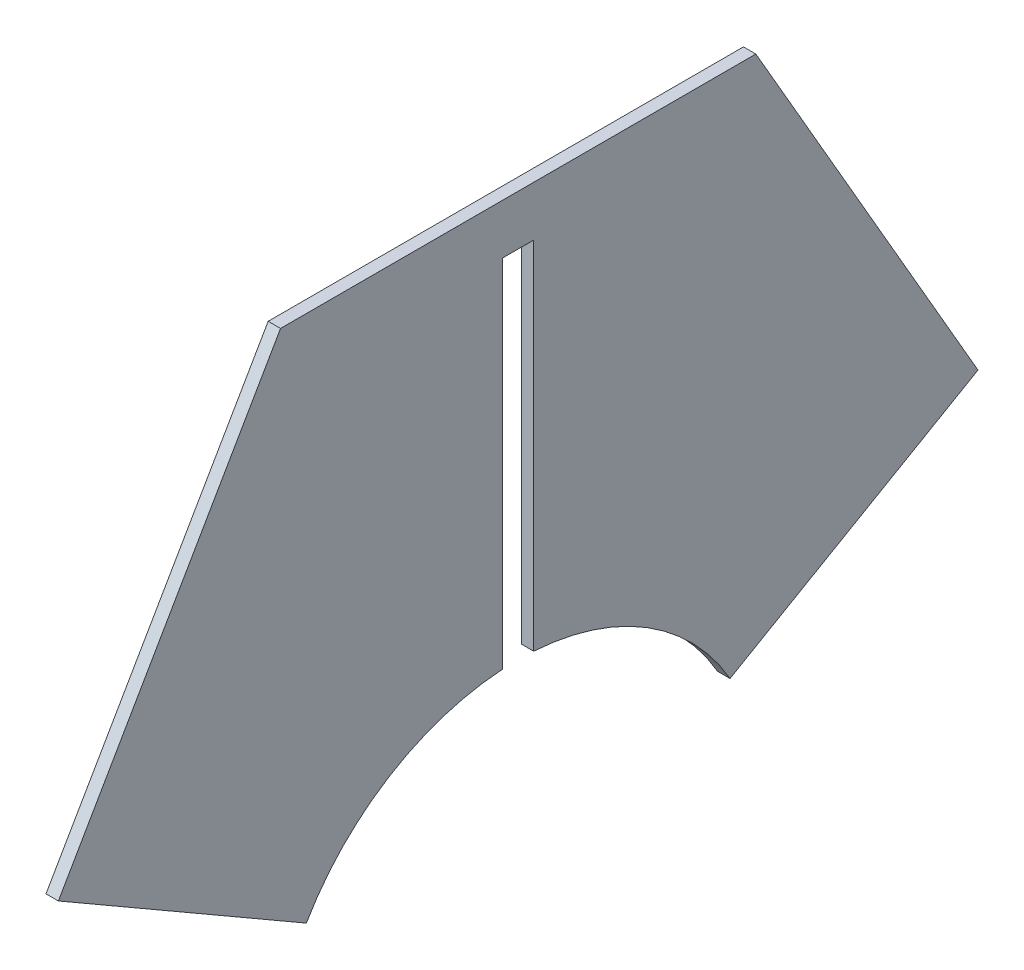
ISO-10303-21;
HEADER;
FILE_DESCRIPTION(('STEP AP214'),'2;1');
FILE_NAME('part.step','',(''),(''),'','','');
FILE_SCHEMA(('AUTOMOTIVE_DESIGN { 1 0 10303 214 1 1 1 1 }'));
ENDSEC;
DATA;
#1=APPLICATION_CONTEXT('core data for automotive mechanical design processes');
#2=APPLICATION_PROTOCOL_DEFINITION('international standard','automotive_design',2000,#1);
#3=PRODUCT_CONTEXT('',#1,'mechanical');
#4=PRODUCT('Part','Part','',(#3));
#5=PRODUCT_RELATED_PRODUCT_CATEGORY('part','',(#4));
#6=PRODUCT_DEFINITION_FORMATION('','',#4);
#7=PRODUCT_DEFINITION_CONTEXT('part definition',#1,'design');
#8=PRODUCT_DEFINITION('design','',#6,#7);
#9=PRODUCT_DEFINITION_SHAPE('','',#8);
#10=(LENGTH_UNIT() NAMED_UNIT(*) SI_UNIT(.MILLI.,.METRE.));
#11=(NAMED_UNIT(*) PLANE_ANGLE_UNIT() SI_UNIT($,.RADIAN.));
#12=(NAMED_UNIT(*) SI_UNIT($,.STERADIAN.) SOLID_ANGLE_UNIT());
#13=UNCERTAINTY_MEASURE_WITH_UNIT(LENGTH_MEASURE(1.E-05),#10,'distance_accuracy_value','');
#14=(GEOMETRIC_REPRESENTATION_CONTEXT(3) GLOBAL_UNCERTAINTY_ASSIGNED_CONTEXT((#13)) GLOBAL_UNIT_ASSIGNED_CONTEXT((#10,
#11,#12)) REPRESENTATION_CONTEXT('',''));
#15=CARTESIAN_POINT('',(0.,0.,0.));
#16=DIRECTION('',(0.,0.,1.));
#17=DIRECTION('',(1.,0.,0.));
#18=AXIS2_PLACEMENT_3D('',#15,#16,#17);
#19=CARTESIAN_POINT('',(4.,0.,0.));
#20=DIRECTION('',(-1.,0.,0.));
#21=DIRECTION('',(0.,0.,1.));
#22=AXIS2_PLACEMENT_3D('',#19,#20,#21);
#23=CYLINDRICAL_SURFACE('',#22,79.);
#24=CARTESIAN_POINT('',(0.,0.,0.));
#25=DIRECTION('',(-1.,0.,0.));
#26=DIRECTION('',(0.,0.,1.));
#27=AXIS2_PLACEMENT_3D('',#24,#25,#26);
#28=CIRCLE('',#27,79.);
#29=CARTESIAN_POINT('',(0.,39.5000000000003,68.4160068989705));
#30=VERTEX_POINT('',#29);
#31=CARTESIAN_POINT('',(0.,78.8416133777081,5.));
#32=VERTEX_POINT('',#31);
#33=EDGE_CURVE('E141',#30,#32,#28,.T.);
#34=ORIENTED_EDGE('',*,*,#33,.T.);
#35=DIRECTION('',(-1.,0.,0.));
#36=VECTOR('',#35,1.);
#37=CARTESIAN_POINT('',(4.,78.8416133777081,5.));
#38=LINE('',#37,#36);
#39=CARTESIAN_POINT('',(4.,78.8416133777081,5.));
#40=VERTEX_POINT('',#39);
#41=EDGE_CURVE('E11',#40,#32,#38,.T.);
#42=ORIENTED_EDGE('',*,*,#41,.F.);
#43=CARTESIAN_POINT('',(4.,0.,0.));
#44=DIRECTION('',(-1.,0.,0.));
#45=DIRECTION('',(0.,0.,1.));
#46=AXIS2_PLACEMENT_3D('',#43,#44,#45);
#47=CIRCLE('',#46,79.);
#48=CARTESIAN_POINT('',(4.,39.5000000000003,68.4160068989705));
#49=VERTEX_POINT('',#48);
#50=EDGE_CURVE('E159',#49,#40,#47,.T.);
#51=ORIENTED_EDGE('',*,*,#50,.F.);
#52=DIRECTION('',(-1.,0.,0.));
#53=VECTOR('',#52,1.);
#54=CARTESIAN_POINT('',(4.,39.5000000000003,68.4160068989705));
#55=LINE('',#54,#53);
#56=EDGE_CURVE('E137',#49,#30,#55,.T.);
#57=ORIENTED_EDGE('',*,*,#56,.T.);
#58=EDGE_LOOP('',(#34,#42,#51,#57));
#59=FACE_BOUND('',#58,.T.);
#60=ADVANCED_FACE('F33',(#59),#23,.F.);
#61=CARTESIAN_POINT('',(4.,78.8416133777081,5.));
#62=DIRECTION('',(0.,0.,1.));
#63=DIRECTION('',(1.,0.,0.));
#64=AXIS2_PLACEMENT_3D('',#61,#62,#63);
#65=PLANE('',#64);
#66=DIRECTION('',(0.,1.,0.));
#67=VECTOR('',#66,1.);
#68=CARTESIAN_POINT('',(0.,78.8416133777081,5.));
#69=LINE('',#68,#67);
#70=CARTESIAN_POINT('',(0.,193.841613377708,5.));
#71=VERTEX_POINT('',#70);
#72=EDGE_CURVE('E144',#32,#71,#69,.T.);
#73=ORIENTED_EDGE('',*,*,#72,.T.);
#74=DIRECTION('',(-1.,0.,0.));
#75=VECTOR('',#74,1.);
#76=CARTESIAN_POINT('',(4.,193.841613377708,5.));
#77=LINE('',#76,#75);
#78=CARTESIAN_POINT('',(4.,193.841613377708,5.));
#79=VERTEX_POINT('',#78);
#80=EDGE_CURVE('E41',#79,#71,#77,.T.);
#81=ORIENTED_EDGE('',*,*,#80,.F.);
#82=DIRECTION('',(0.,1.,0.));
#83=VECTOR('',#82,1.);
#84=CARTESIAN_POINT('',(4.,78.8416133777081,5.));
#85=LINE('',#84,#83);
#86=EDGE_CURVE('E98',#40,#79,#85,.T.);
#87=ORIENTED_EDGE('',*,*,#86,.F.);
#88=ORIENTED_EDGE('',*,*,#41,.T.);
#89=EDGE_LOOP('',(#73,#81,#87,#88));
#90=FACE_BOUND('',#89,.T.);
#91=ADVANCED_FACE('F208',(#90),#65,.F.);
#92=CARTESIAN_POINT('',(4.,193.841613377708,5.));
#93=DIRECTION('',(0.,1.,0.));
#94=DIRECTION('',(0.,0.,1.));
#95=AXIS2_PLACEMENT_3D('',#92,#93,#94);
#96=PLANE('',#95);
#97=DIRECTION('',(0.,0.,-1.));
#98=VECTOR('',#97,1.);
#99=CARTESIAN_POINT('',(0.,193.841613377708,5.));
#100=LINE('',#99,#98);
#101=CARTESIAN_POINT('',(0.,193.841613377708,-5.));
#102=VERTEX_POINT('',#101);
#103=EDGE_CURVE('E146',#71,#102,#100,.T.);
#104=ORIENTED_EDGE('',*,*,#103,.T.);
#105=DIRECTION('',(-1.,0.,0.));
#106=VECTOR('',#105,1.);
#107=CARTESIAN_POINT('',(4.,193.841613377708,-5.));
#108=LINE('',#107,#106);
#109=CARTESIAN_POINT('',(4.,193.841613377708,-5.));
#110=VERTEX_POINT('',#109);
#111=EDGE_CURVE('E172',#110,#102,#108,.T.);
#112=ORIENTED_EDGE('',*,*,#111,.F.);
#113=DIRECTION('',(0.,0.,-1.));
#114=VECTOR('',#113,1.);
#115=CARTESIAN_POINT('',(4.,193.841613377708,5.));
#116=LINE('',#115,#114);
#117=EDGE_CURVE('E180',#79,#110,#116,.T.);
#118=ORIENTED_EDGE('',*,*,#117,.F.);
#119=ORIENTED_EDGE('',*,*,#80,.T.);
#120=EDGE_LOOP('',(#104,#112,#118,#119));
#121=FACE_BOUND('',#120,.T.);
#122=ADVANCED_FACE('F178',(#121),#96,.F.);
#123=CARTESIAN_POINT('',(4.,193.841613377708,-5.));
#124=DIRECTION('',(0.,0.,-1.));
#125=DIRECTION('',(-1.,0.,0.));
#126=AXIS2_PLACEMENT_3D('',#123,#124,#125);
#127=PLANE('',#126);
#128=DIRECTION('',(0.,-1.,0.));
#129=VECTOR('',#128,1.);
#130=CARTESIAN_POINT('',(0.,193.841613377708,-5.));
#131=LINE('',#130,#129);
#132=CARTESIAN_POINT('',(0.,78.8416133777081,-5.));
#133=VERTEX_POINT('',#132);
#134=EDGE_CURVE('E148',#102,#133,#131,.T.);
#135=ORIENTED_EDGE('',*,*,#134,.T.);
#136=DIRECTION('',(-1.,0.,0.));
#137=VECTOR('',#136,1.);
#138=CARTESIAN_POINT('',(4.,78.8416133777081,-5.));
#139=LINE('',#138,#137);
#140=CARTESIAN_POINT('',(4.,78.8416133777081,-5.));
#141=VERTEX_POINT('',#140);
#142=EDGE_CURVE('E169',#141,#133,#139,.T.);
#143=ORIENTED_EDGE('',*,*,#142,.F.);
#144=DIRECTION('',(0.,-1.,0.));
#145=VECTOR('',#144,1.);
#146=CARTESIAN_POINT('',(4.,193.841613377708,-5.));
#147=LINE('',#146,#145);
#148=EDGE_CURVE('E198',#110,#141,#147,.T.);
#149=ORIENTED_EDGE('',*,*,#148,.F.);
#150=ORIENTED_EDGE('',*,*,#111,.T.);
#151=EDGE_LOOP('',(#135,#143,#149,#150));
#152=FACE_BOUND('',#151,.T.);
#153=ADVANCED_FACE('F189',(#152),#127,.F.);
#154=CARTESIAN_POINT('',(4.,0.,0.));
#155=DIRECTION('',(-1.,0.,0.));
#156=DIRECTION('',(0.,0.,1.));
#157=AXIS2_PLACEMENT_3D('',#154,#155,#156);
#158=CYLINDRICAL_SURFACE('',#157,79.);
#159=CARTESIAN_POINT('',(0.,0.,0.));
#160=DIRECTION('',(-1.,0.,0.));
#161=DIRECTION('',(0.,0.,-1.));
#162=AXIS2_PLACEMENT_3D('',#159,#160,#161);
#163=CIRCLE('',#162,79.);
#164=CARTESIAN_POINT('',(0.,39.4999999999998,-68.4160068989707));
#165=VERTEX_POINT('',#164);
#166=EDGE_CURVE('E150',#133,#165,#163,.T.);
#167=ORIENTED_EDGE('',*,*,#166,.T.);
#168=DIRECTION('',(-1.,0.,0.));
#169=VECTOR('',#168,1.);
#170=CARTESIAN_POINT('',(4.,39.4999999999998,-68.4160068989707));
#171=LINE('',#170,#169);
#172=CARTESIAN_POINT('',(4.,39.4999999999998,-68.4160068989707));
#173=VERTEX_POINT('',#172);
#174=EDGE_CURVE('E166',#173,#165,#171,.T.);
#175=ORIENTED_EDGE('',*,*,#174,.F.);
#176=CARTESIAN_POINT('',(4.,0.,0.));
#177=DIRECTION('',(-1.,0.,0.));
#178=DIRECTION('',(0.,0.,-1.));
#179=AXIS2_PLACEMENT_3D('',#176,#177,#178);
#180=CIRCLE('',#179,79.);
#181=EDGE_CURVE('E195',#141,#173,#180,.T.);
#182=ORIENTED_EDGE('',*,*,#181,.F.);
#183=ORIENTED_EDGE('',*,*,#142,.T.);
#184=EDGE_LOOP('',(#167,#175,#182,#183));
#185=FACE_BOUND('',#184,.T.);
#186=ADVANCED_FACE('F193',(#185),#158,.F.);
#187=CARTESIAN_POINT('',(4.,85.7365149746589,-148.5));
#188=DIRECTION('',(0.,0.86602540378444,0.499999999999998));
#189=DIRECTION('',(0.,-0.499999999999998,0.86602540378444));
#190=AXIS2_PLACEMENT_3D('',#187,#188,#189);
#191=PLANE('',#190);
#192=DIRECTION('',(0.,0.499999999999998,-0.86602540378444));
#193=VECTOR('',#192,1.);
#194=CARTESIAN_POINT('',(0.,85.7365149746589,-148.5));
#195=LINE('',#194,#193);
#196=CARTESIAN_POINT('',(0.,85.7365149746589,-148.5));
#197=VERTEX_POINT('',#196);
#198=EDGE_CURVE('E152',#165,#197,#195,.T.);
#199=ORIENTED_EDGE('',*,*,#198,.T.);
#200=DIRECTION('',(-1.,0.,0.));
#201=VECTOR('',#200,1.);
#202=CARTESIAN_POINT('',(4.,85.7365149746589,-148.5));
#203=LINE('',#202,#201);
#204=CARTESIAN_POINT('',(4.,85.7365149746589,-148.5));
#205=VERTEX_POINT('',#204);
#206=EDGE_CURVE('E163',#205,#197,#203,.T.);
#207=ORIENTED_EDGE('',*,*,#206,.F.);
#208=DIRECTION('',(0.,0.499999999999998,-0.86602540378444));
#209=VECTOR('',#208,1.);
#210=CARTESIAN_POINT('',(4.,85.7365149746589,-148.5));
#211=LINE('',#210,#209);
#212=EDGE_CURVE('E197',#173,#205,#211,.T.);
#213=ORIENTED_EDGE('',*,*,#212,.F.);
#214=ORIENTED_EDGE('',*,*,#174,.T.);
#215=EDGE_LOOP('',(#199,#207,#213,#214));
#216=FACE_BOUND('',#215,.T.);
#217=ADVANCED_FACE('F220',(#216),#191,.F.);
#218=CARTESIAN_POINT('',(4.,210.,-76.7564434701784));
#219=DIRECTION('',(0.,-0.499999999999998,0.86602540378444));
#220=DIRECTION('',(0.,-0.86602540378444,-0.499999999999998));
#221=AXIS2_PLACEMENT_3D('',#218,#219,#220);
#222=PLANE('',#221);
#223=DIRECTION('',(0.,0.86602540378444,0.499999999999998));
#224=VECTOR('',#223,1.);
#225=CARTESIAN_POINT('',(0.,210.,-76.7564434701784));
#226=LINE('',#225,#224);
#227=CARTESIAN_POINT('',(0.,210.,-76.7564434701784));
#228=VERTEX_POINT('',#227);
#229=EDGE_CURVE('E154',#197,#228,#226,.T.);
#230=ORIENTED_EDGE('',*,*,#229,.T.);
#231=DIRECTION('',(-1.,0.,0.));
#232=VECTOR('',#231,1.);
#233=CARTESIAN_POINT('',(4.,210.,-76.7564434701784));
#234=LINE('',#233,#232);
#235=CARTESIAN_POINT('',(4.,210.,-76.7564434701784));
#236=VERTEX_POINT('',#235);
#237=EDGE_CURVE('E132',#236,#228,#234,.T.);
#238=ORIENTED_EDGE('',*,*,#237,.F.);
#239=DIRECTION('',(0.,0.86602540378444,0.499999999999998));
#240=VECTOR('',#239,1.);
#241=CARTESIAN_POINT('',(4.,210.,-76.7564434701784));
#242=LINE('',#241,#240);
#243=EDGE_CURVE('E123',#205,#236,#242,.T.);
#244=ORIENTED_EDGE('',*,*,#243,.F.);
#245=ORIENTED_EDGE('',*,*,#206,.T.);
#246=EDGE_LOOP('',(#230,#238,#244,#245));
#247=FACE_BOUND('',#246,.T.);
#248=ADVANCED_FACE('F223',(#247),#222,.F.);
#249=CARTESIAN_POINT('',(4.,210.,76.7564434701784));
#250=DIRECTION('',(0.,-1.,0.));
#251=DIRECTION('',(0.,0.,-1.));
#252=AXIS2_PLACEMENT_3D('',#249,#250,#251);
#253=PLANE('',#252);
#254=DIRECTION('',(0.,0.,1.));
#255=VECTOR('',#254,1.);
#256=CARTESIAN_POINT('',(0.,210.,76.7564434701784));
#257=LINE('',#256,#255);
#258=CARTESIAN_POINT('',(0.,210.,76.7564434701784));
#259=VERTEX_POINT('',#258);
#260=EDGE_CURVE('E131',#228,#259,#257,.T.);
#261=ORIENTED_EDGE('',*,*,#260,.T.);
#262=DIRECTION('',(-1.,0.,0.));
#263=VECTOR('',#262,1.);
#264=CARTESIAN_POINT('',(4.,210.,76.7564434701784));
#265=LINE('',#264,#263);
#266=CARTESIAN_POINT('',(4.,210.,76.7564434701784));
#267=VERTEX_POINT('',#266);
#268=EDGE_CURVE('E128',#267,#259,#265,.T.);
#269=ORIENTED_EDGE('',*,*,#268,.F.);
#270=DIRECTION('',(0.,0.,1.));
#271=VECTOR('',#270,1.);
#272=CARTESIAN_POINT('',(4.,210.,76.7564434701784));
#273=LINE('',#272,#271);
#274=EDGE_CURVE('E117',#236,#267,#273,.T.);
#275=ORIENTED_EDGE('',*,*,#274,.F.);
#276=ORIENTED_EDGE('',*,*,#237,.T.);
#277=EDGE_LOOP('',(#261,#269,#275,#276));
#278=FACE_BOUND('',#277,.T.);
#279=ADVANCED_FACE('F129',(#278),#253,.F.);
#280=CARTESIAN_POINT('',(4.,85.7365149746603,148.5));
#281=DIRECTION('',(0.,-0.500000000000004,-0.866025403784436));
#282=DIRECTION('',(0.,0.866025403784436,-0.500000000000004));
#283=AXIS2_PLACEMENT_3D('',#280,#281,#282);
#284=PLANE('',#283);
#285=DIRECTION('',(0.,-0.866025403784436,0.500000000000004));
#286=VECTOR('',#285,1.);
#287=CARTESIAN_POINT('',(0.,85.7365149746603,148.5));
#288=LINE('',#287,#286);
#289=CARTESIAN_POINT('',(0.,85.7365149746603,148.5));
#290=VERTEX_POINT('',#289);
#291=EDGE_CURVE('E84',#259,#290,#288,.T.);
#292=ORIENTED_EDGE('',*,*,#291,.T.);
#293=DIRECTION('',(-1.,0.,0.));
#294=VECTOR('',#293,1.);
#295=CARTESIAN_POINT('',(4.,85.7365149746603,148.5));
#296=LINE('',#295,#294);
#297=CARTESIAN_POINT('',(4.,85.7365149746603,148.5));
#298=VERTEX_POINT('',#297);
#299=EDGE_CURVE('E133',#298,#290,#296,.T.);
#300=ORIENTED_EDGE('',*,*,#299,.F.);
#301=DIRECTION('',(0.,-0.866025403784436,0.500000000000004));
#302=VECTOR('',#301,1.);
#303=CARTESIAN_POINT('',(4.,85.7365149746603,148.5));
#304=LINE('',#303,#302);
#305=EDGE_CURVE('E121',#267,#298,#304,.T.);
#306=ORIENTED_EDGE('',*,*,#305,.F.);
#307=ORIENTED_EDGE('',*,*,#268,.T.);
#308=EDGE_LOOP('',(#292,#300,#306,#307));
#309=FACE_BOUND('',#308,.T.);
#310=ADVANCED_FACE('F135',(#309),#284,.F.);
#311=CARTESIAN_POINT('',(4.,39.5000000000003,68.4160068989705));
#312=DIRECTION('',(0.,0.866025403784436,-0.500000000000004));
#313=DIRECTION('',(0.,0.500000000000004,0.866025403784436));
#314=AXIS2_PLACEMENT_3D('',#311,#312,#313);
#315=PLANE('',#314);
#316=DIRECTION('',(0.,-0.500000000000004,-0.866025403784436));
#317=VECTOR('',#316,1.);
#318=CARTESIAN_POINT('',(0.,39.5000000000003,68.4160068989705));
#319=LINE('',#318,#317);
#320=EDGE_CURVE('E90',#290,#30,#319,.T.);
#321=ORIENTED_EDGE('',*,*,#320,.T.);
#322=ORIENTED_EDGE('',*,*,#56,.F.);
#323=DIRECTION('',(0.,-0.500000000000004,-0.866025403784436));
#324=VECTOR('',#323,1.);
#325=CARTESIAN_POINT('',(4.,39.5000000000003,68.4160068989705));
#326=LINE('',#325,#324);
#327=EDGE_CURVE('E49',#298,#49,#326,.T.);
#328=ORIENTED_EDGE('',*,*,#327,.F.);
#329=ORIENTED_EDGE('',*,*,#299,.T.);
#330=EDGE_LOOP('',(#321,#322,#328,#329));
#331=FACE_BOUND('',#330,.T.);
#332=ADVANCED_FACE('F232',(#331),#315,.F.);
#333=CARTESIAN_POINT('',(4.,0.,0.));
#334=DIRECTION('',(-1.,0.,0.));
#335=DIRECTION('',(0.,0.,1.));
#336=AXIS2_PLACEMENT_3D('',#333,#334,#335);
#337=PLANE('',#336);
#338=ORIENTED_EDGE('',*,*,#50,.T.);
#339=ORIENTED_EDGE('',*,*,#86,.T.);
#340=ORIENTED_EDGE('',*,*,#117,.T.);
#341=ORIENTED_EDGE('',*,*,#148,.T.);
#342=ORIENTED_EDGE('',*,*,#181,.T.);
#343=ORIENTED_EDGE('',*,*,#212,.T.);
#344=ORIENTED_EDGE('',*,*,#243,.T.);
#345=ORIENTED_EDGE('',*,*,#274,.T.);
#346=ORIENTED_EDGE('',*,*,#305,.T.);
#347=ORIENTED_EDGE('',*,*,#327,.T.);
#348=EDGE_LOOP('',(#338,#339,#340,#341,#342,#343,#344,#345,#346,#347));
#349=FACE_BOUND('',#348,.T.);
#350=ADVANCED_FACE('F119',(#349),#337,.F.);
#351=CARTESIAN_POINT('',(0.,0.,0.));
#352=DIRECTION('',(-1.,0.,0.));
#353=DIRECTION('',(0.,0.,1.));
#354=AXIS2_PLACEMENT_3D('',#351,#352,#353);
#355=PLANE('',#354);
#356=ORIENTED_EDGE('',*,*,#33,.F.);
#357=ORIENTED_EDGE('',*,*,#320,.F.);
#358=ORIENTED_EDGE('',*,*,#291,.F.);
#359=ORIENTED_EDGE('',*,*,#260,.F.);
#360=ORIENTED_EDGE('',*,*,#229,.F.);
#361=ORIENTED_EDGE('',*,*,#198,.F.);
#362=ORIENTED_EDGE('',*,*,#166,.F.);
#363=ORIENTED_EDGE('',*,*,#134,.F.);
#364=ORIENTED_EDGE('',*,*,#103,.F.);
#365=ORIENTED_EDGE('',*,*,#72,.F.);
#366=EDGE_LOOP('',(#356,#357,#358,#359,#360,#361,#362,#363,#364,#365));
#367=FACE_BOUND('',#366,.T.);
#368=ADVANCED_FACE('F184',(#367),#355,.T.);
#369=CLOSED_SHELL('',(#60,#91,#122,#153,#186,#217,#248,#279,#310,#332,#350,#368));
#370=MANIFOLD_SOLID_BREP('B2',#369);
#371=ADVANCED_BREP_SHAPE_REPRESENTATION('',(#18,#370),#14);
#372=SHAPE_DEFINITION_REPRESENTATION(#9,#371);
ENDSEC;
END-ISO-10303-21;
